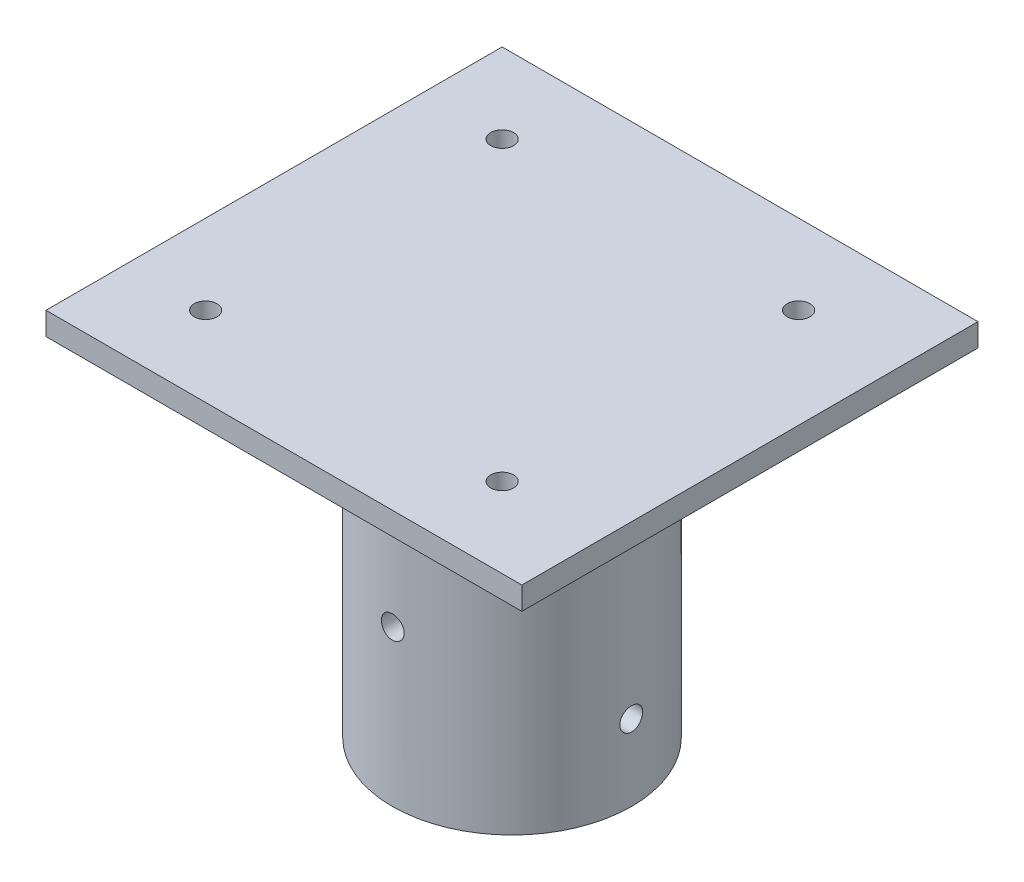
ISO-10303-21;
HEADER;
FILE_DESCRIPTION(('STEP AP214'),'2;1');
FILE_NAME('part.step','',(''),(''),'','','');
FILE_SCHEMA(('AUTOMOTIVE_DESIGN { 1 0 10303 214 1 1 1 1 }'));
ENDSEC;
DATA;
#1=APPLICATION_CONTEXT('core data for automotive mechanical design processes');
#2=APPLICATION_PROTOCOL_DEFINITION('international standard','automotive_design',2000,#1);
#3=PRODUCT_CONTEXT('',#1,'mechanical');
#4=PRODUCT('Part','Part','',(#3));
#5=PRODUCT_RELATED_PRODUCT_CATEGORY('part','',(#4));
#6=PRODUCT_DEFINITION_FORMATION('','',#4);
#7=PRODUCT_DEFINITION_CONTEXT('part definition',#1,'design');
#8=PRODUCT_DEFINITION('design','',#6,#7);
#9=PRODUCT_DEFINITION_SHAPE('','',#8);
#10=(LENGTH_UNIT() NAMED_UNIT(*) SI_UNIT(.MILLI.,.METRE.));
#11=(NAMED_UNIT(*) PLANE_ANGLE_UNIT() SI_UNIT($,.RADIAN.));
#12=(NAMED_UNIT(*) SI_UNIT($,.STERADIAN.) SOLID_ANGLE_UNIT());
#13=UNCERTAINTY_MEASURE_WITH_UNIT(LENGTH_MEASURE(1.E-05),#10,'distance_accuracy_value','');
#14=(GEOMETRIC_REPRESENTATION_CONTEXT(3) GLOBAL_UNCERTAINTY_ASSIGNED_CONTEXT((#13)) GLOBAL_UNIT_ASSIGNED_CONTEXT((#10,
#11,#12)) REPRESENTATION_CONTEXT('',''));
#15=CARTESIAN_POINT('',(0.,0.,0.));
#16=DIRECTION('',(0.,0.,1.));
#17=DIRECTION('',(1.,0.,0.));
#18=AXIS2_PLACEMENT_3D('',#15,#16,#17);
#19=CARTESIAN_POINT('',(15.4110668103448,2.54,-16.51));
#20=DIRECTION('',(0.,-1.,0.));
#21=DIRECTION('',(0.,0.,-1.));
#22=AXIS2_PLACEMENT_3D('',#19,#20,#21);
#23=CYLINDRICAL_SURFACE('',#22,1.27);
#24=CARTESIAN_POINT('',(15.4110668103448,2.54,-16.51));
#25=DIRECTION('',(0.,-1.,0.));
#26=DIRECTION('',(0.,0.,-1.));
#27=AXIS2_PLACEMENT_3D('',#24,#25,#26);
#28=CIRCLE('',#27,1.27);
#29=CARTESIAN_POINT('',(15.4110668103448,2.54,-17.78));
#30=VERTEX_POINT('',#29);
#31=EDGE_CURVE('E125',#30,#30,#28,.T.);
#32=ORIENTED_EDGE('',*,*,#31,.F.);
#33=EDGE_LOOP('',(#32));
#34=FACE_BOUND('',#33,.T.);
#35=CARTESIAN_POINT('',(15.4110668103448,0.,-16.51));
#36=DIRECTION('',(0.,-1.,0.));
#37=DIRECTION('',(0.,0.,-1.));
#38=AXIS2_PLACEMENT_3D('',#35,#36,#37);
#39=CIRCLE('',#38,1.27);
#40=CARTESIAN_POINT('',(15.4110668103448,0.,-17.78));
#41=VERTEX_POINT('',#40);
#42=EDGE_CURVE('E46',#41,#41,#39,.T.);
#43=ORIENTED_EDGE('',*,*,#42,.T.);
#44=EDGE_LOOP('',(#43));
#45=FACE_BOUND('',#44,.T.);
#46=ADVANCED_FACE('F33',(#34,#45),#23,.F.);
#47=CARTESIAN_POINT('',(-17.6089331896552,2.54,-16.51));
#48=DIRECTION('',(0.,-1.,0.));
#49=DIRECTION('',(0.,0.,-1.));
#50=AXIS2_PLACEMENT_3D('',#47,#48,#49);
#51=CYLINDRICAL_SURFACE('',#50,1.27);
#52=CARTESIAN_POINT('',(-17.6089331896552,2.54,-16.51));
#53=DIRECTION('',(0.,-1.,0.));
#54=DIRECTION('',(0.,0.,-1.));
#55=AXIS2_PLACEMENT_3D('',#52,#53,#54);
#56=CIRCLE('',#55,1.27);
#57=CARTESIAN_POINT('',(-17.6089331896552,2.54,-17.78));
#58=VERTEX_POINT('',#57);
#59=EDGE_CURVE('E119',#58,#58,#56,.T.);
#60=ORIENTED_EDGE('',*,*,#59,.F.);
#61=EDGE_LOOP('',(#60));
#62=FACE_BOUND('',#61,.T.);
#63=CARTESIAN_POINT('',(-17.6089331896552,0.,-16.51));
#64=DIRECTION('',(0.,-1.,0.));
#65=DIRECTION('',(0.,0.,-1.));
#66=AXIS2_PLACEMENT_3D('',#63,#64,#65);
#67=CIRCLE('',#66,1.27);
#68=CARTESIAN_POINT('',(-17.6089331896552,0.,-17.78));
#69=VERTEX_POINT('',#68);
#70=EDGE_CURVE('E122',#69,#69,#67,.T.);
#71=ORIENTED_EDGE('',*,*,#70,.T.);
#72=EDGE_LOOP('',(#71));
#73=FACE_BOUND('',#72,.T.);
#74=ADVANCED_FACE('F190',(#62,#73),#51,.F.);
#75=CARTESIAN_POINT('',(26.4989331896552,2.54,25.4));
#76=DIRECTION('',(-1.,0.,0.));
#77=DIRECTION('',(0.,0.,1.));
#78=AXIS2_PLACEMENT_3D('',#75,#76,#77);
#79=PLANE('',#78);
#80=DIRECTION('',(0.,0.,-1.));
#81=VECTOR('',#80,1.);
#82=CARTESIAN_POINT('',(26.4989331896552,0.,25.4));
#83=LINE('',#82,#81);
#84=CARTESIAN_POINT('',(26.4989331896552,0.,25.4));
#85=VERTEX_POINT('',#84);
#86=CARTESIAN_POINT('',(26.4989331896552,0.,-25.4));
#87=VERTEX_POINT('',#86);
#88=EDGE_CURVE('E107',#85,#87,#83,.T.);
#89=ORIENTED_EDGE('',*,*,#88,.T.);
#90=DIRECTION('',(0.,-1.,0.));
#91=VECTOR('',#90,1.);
#92=CARTESIAN_POINT('',(26.4989331896552,2.54,-25.4));
#93=LINE('',#92,#91);
#94=CARTESIAN_POINT('',(26.4989331896552,2.54,-25.4));
#95=VERTEX_POINT('',#94);
#96=EDGE_CURVE('E99',#95,#87,#93,.T.);
#97=ORIENTED_EDGE('',*,*,#96,.F.);
#98=DIRECTION('',(0.,0.,-1.));
#99=VECTOR('',#98,1.);
#100=CARTESIAN_POINT('',(26.4989331896552,2.54,25.4));
#101=LINE('',#100,#99);
#102=CARTESIAN_POINT('',(26.4989331896552,2.54,25.4));
#103=VERTEX_POINT('',#102);
#104=EDGE_CURVE('E90',#103,#95,#101,.T.);
#105=ORIENTED_EDGE('',*,*,#104,.F.);
#106=DIRECTION('',(0.,-1.,0.));
#107=VECTOR('',#106,1.);
#108=CARTESIAN_POINT('',(26.4989331896552,2.54,25.4));
#109=LINE('',#108,#107);
#110=EDGE_CURVE('E55',#103,#85,#109,.T.);
#111=ORIENTED_EDGE('',*,*,#110,.T.);
#112=EDGE_LOOP('',(#89,#97,#105,#111));
#113=FACE_BOUND('',#112,.T.);
#114=ADVANCED_FACE('F188',(#113),#79,.F.);
#115=CARTESIAN_POINT('',(26.4989331896552,2.54,-25.4));
#116=DIRECTION('',(0.,0.,1.));
#117=DIRECTION('',(1.,0.,0.));
#118=AXIS2_PLACEMENT_3D('',#115,#116,#117);
#119=PLANE('',#118);
#120=DIRECTION('',(-1.,0.,0.));
#121=VECTOR('',#120,1.);
#122=CARTESIAN_POINT('',(26.4989331896552,0.,-25.4));
#123=LINE('',#122,#121);
#124=CARTESIAN_POINT('',(-26.4989331896552,0.,-25.4));
#125=VERTEX_POINT('',#124);
#126=EDGE_CURVE('E96',#87,#125,#123,.T.);
#127=ORIENTED_EDGE('',*,*,#126,.T.);
#128=DIRECTION('',(0.,-1.,0.));
#129=VECTOR('',#128,1.);
#130=CARTESIAN_POINT('',(-26.4989331896552,2.54,-25.4));
#131=LINE('',#130,#129);
#132=CARTESIAN_POINT('',(-26.4989331896552,2.54,-25.4));
#133=VERTEX_POINT('',#132);
#134=EDGE_CURVE('E94',#133,#125,#131,.T.);
#135=ORIENTED_EDGE('',*,*,#134,.F.);
#136=DIRECTION('',(-1.,0.,0.));
#137=VECTOR('',#136,1.);
#138=CARTESIAN_POINT('',(26.4989331896552,2.54,-25.4));
#139=LINE('',#138,#137);
#140=EDGE_CURVE('E81',#95,#133,#139,.T.);
#141=ORIENTED_EDGE('',*,*,#140,.F.);
#142=ORIENTED_EDGE('',*,*,#96,.T.);
#143=EDGE_LOOP('',(#127,#135,#141,#142));
#144=FACE_BOUND('',#143,.T.);
#145=ADVANCED_FACE('F95',(#144),#119,.F.);
#146=CARTESIAN_POINT('',(-26.4989331896552,2.54,25.4));
#147=DIRECTION('',(-1.,0.,0.));
#148=DIRECTION('',(0.,0.,1.));
#149=AXIS2_PLACEMENT_3D('',#146,#147,#148);
#150=PLANE('',#149);
#151=DIRECTION('',(0.,0.,-1.));
#152=VECTOR('',#151,1.);
#153=CARTESIAN_POINT('',(-26.4989331896552,0.,25.4));
#154=LINE('',#153,#152);
#155=CARTESIAN_POINT('',(-26.4989331896552,0.,25.4));
#156=VERTEX_POINT('',#155);
#157=EDGE_CURVE('E111',#156,#125,#154,.T.);
#158=ORIENTED_EDGE('',*,*,#157,.F.);
#159=DIRECTION('',(0.,-1.,0.));
#160=VECTOR('',#159,1.);
#161=CARTESIAN_POINT('',(-26.4989331896552,2.54,25.4));
#162=LINE('',#161,#160);
#163=CARTESIAN_POINT('',(-26.4989331896552,2.54,25.4));
#164=VERTEX_POINT('',#163);
#165=EDGE_CURVE('E69',#164,#156,#162,.T.);
#166=ORIENTED_EDGE('',*,*,#165,.F.);
#167=DIRECTION('',(0.,0.,-1.));
#168=VECTOR('',#167,1.);
#169=CARTESIAN_POINT('',(-26.4989331896552,2.54,25.4));
#170=LINE('',#169,#168);
#171=EDGE_CURVE('E89',#164,#133,#170,.T.);
#172=ORIENTED_EDGE('',*,*,#171,.T.);
#173=ORIENTED_EDGE('',*,*,#134,.T.);
#174=EDGE_LOOP('',(#158,#166,#172,#173));
#175=FACE_BOUND('',#174,.T.);
#176=ADVANCED_FACE('F101',(#175),#150,.T.);
#177=CARTESIAN_POINT('',(26.4989331896552,2.54,25.4));
#178=DIRECTION('',(0.,0.,1.));
#179=DIRECTION('',(1.,0.,0.));
#180=AXIS2_PLACEMENT_3D('',#177,#178,#179);
#181=PLANE('',#180);
#182=DIRECTION('',(-1.,0.,0.));
#183=VECTOR('',#182,1.);
#184=CARTESIAN_POINT('',(26.4989331896552,0.,25.4));
#185=LINE('',#184,#183);
#186=EDGE_CURVE('E113',#85,#156,#185,.T.);
#187=ORIENTED_EDGE('',*,*,#186,.F.);
#188=ORIENTED_EDGE('',*,*,#110,.F.);
#189=DIRECTION('',(-1.,0.,0.));
#190=VECTOR('',#189,1.);
#191=CARTESIAN_POINT('',(26.4989331896552,2.54,25.4));
#192=LINE('',#191,#190);
#193=EDGE_CURVE('E102',#103,#164,#192,.T.);
#194=ORIENTED_EDGE('',*,*,#193,.T.);
#195=ORIENTED_EDGE('',*,*,#165,.T.);
#196=EDGE_LOOP('',(#187,#188,#194,#195));
#197=FACE_BOUND('',#196,.T.);
#198=ADVANCED_FACE('F177',(#197),#181,.T.);
#199=CARTESIAN_POINT('',(0.,2.54,0.));
#200=DIRECTION('',(0.,1.,0.));
#201=DIRECTION('',(0.,0.,1.));
#202=AXIS2_PLACEMENT_3D('',#199,#200,#201);
#203=PLANE('',#202);
#204=CARTESIAN_POINT('',(15.4110668103448,2.54,16.51));
#205=DIRECTION('',(0.,-1.,0.));
#206=DIRECTION('',(0.,0.,-1.));
#207=AXIS2_PLACEMENT_3D('',#204,#205,#206);
#208=CIRCLE('',#207,1.27);
#209=CARTESIAN_POINT('',(15.4110668103448,2.54,15.24));
#210=VERTEX_POINT('',#209);
#211=EDGE_CURVE('E310',#210,#210,#208,.T.);
#212=ORIENTED_EDGE('',*,*,#211,.T.);
#213=EDGE_LOOP('',(#212));
#214=FACE_BOUND('',#213,.T.);
#215=CARTESIAN_POINT('',(-17.6089331896552,2.54,16.51));
#216=DIRECTION('',(0.,-1.,0.));
#217=DIRECTION('',(0.,0.,-1.));
#218=AXIS2_PLACEMENT_3D('',#215,#216,#217);
#219=CIRCLE('',#218,1.27);
#220=CARTESIAN_POINT('',(-17.6089331896552,2.54,15.24));
#221=VERTEX_POINT('',#220);
#222=EDGE_CURVE('E109',#221,#221,#219,.T.);
#223=ORIENTED_EDGE('',*,*,#222,.T.);
#224=EDGE_LOOP('',(#223));
#225=FACE_BOUND('',#224,.T.);
#226=ORIENTED_EDGE('',*,*,#104,.T.);
#227=ORIENTED_EDGE('',*,*,#140,.T.);
#228=ORIENTED_EDGE('',*,*,#171,.F.);
#229=ORIENTED_EDGE('',*,*,#193,.F.);
#230=EDGE_LOOP('',(#226,#227,#228,#229));
#231=FACE_BOUND('',#230,.T.);
#232=ORIENTED_EDGE('',*,*,#59,.T.);
#233=EDGE_LOOP('',(#232));
#234=FACE_BOUND('',#233,.T.);
#235=ORIENTED_EDGE('',*,*,#31,.T.);
#236=EDGE_LOOP('',(#235));
#237=FACE_BOUND('',#236,.T.);
#238=ADVANCED_FACE('F85',(#214,#225,#231,#234,#237),#203,.T.);
#239=CARTESIAN_POINT('',(0.,0.,0.));
#240=DIRECTION('',(0.,1.,0.));
#241=DIRECTION('',(0.,0.,1.));
#242=AXIS2_PLACEMENT_3D('',#239,#240,#241);
#243=PLANE('',#242);
#244=CARTESIAN_POINT('',(0.,0.,0.));
#245=DIRECTION('',(0.,1.,0.));
#246=DIRECTION('',(0.,0.,1.));
#247=AXIS2_PLACEMENT_3D('',#244,#245,#246);
#248=CIRCLE('',#247,13.335);
#249=CARTESIAN_POINT('',(0.,0.,13.335));
#250=VERTEX_POINT('',#249);
#251=EDGE_CURVE('E11',#250,#250,#248,.F.);
#252=ORIENTED_EDGE('',*,*,#251,.F.);
#253=EDGE_LOOP('',(#252));
#254=FACE_BOUND('',#253,.T.);
#255=CARTESIAN_POINT('',(15.4110668103448,0.,16.51));
#256=DIRECTION('',(0.,-1.,0.));
#257=DIRECTION('',(0.,0.,-1.));
#258=AXIS2_PLACEMENT_3D('',#255,#256,#257);
#259=CIRCLE('',#258,1.27);
#260=CARTESIAN_POINT('',(15.4110668103448,0.,15.24));
#261=VERTEX_POINT('',#260);
#262=EDGE_CURVE('E300',#261,#261,#259,.T.);
#263=ORIENTED_EDGE('',*,*,#262,.F.);
#264=EDGE_LOOP('',(#263));
#265=FACE_BOUND('',#264,.T.);
#266=CARTESIAN_POINT('',(-17.6089331896552,0.,16.51));
#267=DIRECTION('',(0.,-1.,0.));
#268=DIRECTION('',(0.,0.,-1.));
#269=AXIS2_PLACEMENT_3D('',#266,#267,#268);
#270=CIRCLE('',#269,1.27);
#271=CARTESIAN_POINT('',(-17.6089331896552,0.,15.24));
#272=VERTEX_POINT('',#271);
#273=EDGE_CURVE('E304',#272,#272,#270,.T.);
#274=ORIENTED_EDGE('',*,*,#273,.F.);
#275=EDGE_LOOP('',(#274));
#276=FACE_BOUND('',#275,.T.);
#277=ORIENTED_EDGE('',*,*,#88,.F.);
#278=ORIENTED_EDGE('',*,*,#186,.T.);
#279=ORIENTED_EDGE('',*,*,#157,.T.);
#280=ORIENTED_EDGE('',*,*,#126,.F.);
#281=EDGE_LOOP('',(#277,#278,#279,#280));
#282=FACE_BOUND('',#281,.T.);
#283=ORIENTED_EDGE('',*,*,#70,.F.);
#284=EDGE_LOOP('',(#283));
#285=FACE_BOUND('',#284,.T.);
#286=ORIENTED_EDGE('',*,*,#42,.F.);
#287=EDGE_LOOP('',(#286));
#288=FACE_BOUND('',#287,.T.);
#289=ADVANCED_FACE('F173',(#254,#265,#276,#282,#285,#288),#243,.F.);
#290=CARTESIAN_POINT('',(-17.6089331896552,2.54,16.51));
#291=DIRECTION('',(0.,-1.,0.));
#292=DIRECTION('',(0.,0.,-1.));
#293=AXIS2_PLACEMENT_3D('',#290,#291,#292);
#294=CYLINDRICAL_SURFACE('',#293,1.27);
#295=ORIENTED_EDGE('',*,*,#222,.F.);
#296=EDGE_LOOP('',(#295));
#297=FACE_BOUND('',#296,.T.);
#298=ORIENTED_EDGE('',*,*,#273,.T.);
#299=EDGE_LOOP('',(#298));
#300=FACE_BOUND('',#299,.T.);
#301=ADVANCED_FACE('F169',(#297,#300),#294,.F.);
#302=CARTESIAN_POINT('',(15.4110668103448,2.54,16.51));
#303=DIRECTION('',(0.,-1.,0.));
#304=DIRECTION('',(0.,0.,-1.));
#305=AXIS2_PLACEMENT_3D('',#302,#303,#304);
#306=CYLINDRICAL_SURFACE('',#305,1.27);
#307=ORIENTED_EDGE('',*,*,#211,.F.);
#308=EDGE_LOOP('',(#307));
#309=FACE_BOUND('',#308,.T.);
#310=ORIENTED_EDGE('',*,*,#262,.T.);
#311=EDGE_LOOP('',(#310));
#312=FACE_BOUND('',#311,.T.);
#313=ADVANCED_FACE('F165',(#309,#312),#306,.F.);
#314=CARTESIAN_POINT('',(0.,-38.1,0.));
#315=DIRECTION('',(0.,-1.,0.));
#316=DIRECTION('',(0.,0.,-1.));
#317=AXIS2_PLACEMENT_3D('',#314,#315,#316);
#318=PLANE('',#317);
#319=CARTESIAN_POINT('',(0.,-38.1,0.));
#320=DIRECTION('',(0.,-1.,0.));
#321=DIRECTION('',(0.,0.,-1.));
#322=AXIS2_PLACEMENT_3D('',#319,#320,#321);
#323=CIRCLE('',#322,13.335);
#324=CARTESIAN_POINT('',(0.,-38.1,-13.335));
#325=VERTEX_POINT('',#324);
#326=EDGE_CURVE('E294',#325,#325,#323,.T.);
#327=ORIENTED_EDGE('',*,*,#326,.T.);
#328=EDGE_LOOP('',(#327));
#329=FACE_BOUND('',#328,.T.);
#330=CARTESIAN_POINT('',(0.,-38.1,0.));
#331=DIRECTION('',(0.,-1.,0.));
#332=DIRECTION('',(0.,0.,-1.));
#333=AXIS2_PLACEMENT_3D('',#330,#331,#332);
#334=CIRCLE('',#333,9.525);
#335=CARTESIAN_POINT('',(0.,-38.1,-9.525));
#336=VERTEX_POINT('',#335);
#337=EDGE_CURVE('E157',#336,#336,#334,.T.);
#338=ORIENTED_EDGE('',*,*,#337,.F.);
#339=EDGE_LOOP('',(#338));
#340=FACE_BOUND('',#339,.T.);
#341=ADVANCED_FACE('F163',(#329,#340),#318,.T.);
#342=CARTESIAN_POINT('',(0.,-38.1,0.));
#343=DIRECTION('',(0.,1.,0.));
#344=DIRECTION('',(0.,0.,1.));
#345=AXIS2_PLACEMENT_3D('',#342,#343,#344);
#346=CYLINDRICAL_SURFACE('',#345,13.335);
#347=CARTESIAN_POINT('',(13.274386049833,-29.639158728267,-1.27));
#348=CARTESIAN_POINT('',(13.2743868469173,-29.7103214111816,-1.26999690913642));
#349=CARTESIAN_POINT('',(13.2749644592863,-29.7815315712348,-1.26399860947089));
#350=CARTESIAN_POINT('',(13.2772122693226,-29.9219787923522,-1.24016013345922));
#351=CARTESIAN_POINT('',(13.2788836813539,-29.9912135710349,-1.22230679502754));
#352=CARTESIAN_POINT('',(13.2831280871879,-30.1256557279515,-1.17528174591728));
#353=CARTESIAN_POINT('',(13.2857005451113,-30.1908654729413,-1.14611676151429));
#354=CARTESIAN_POINT('',(13.2914565288024,-30.3154495928365,-1.07730894479932));
#355=CARTESIAN_POINT('',(13.2946399303542,-30.3748251502348,-1.037668241776));
#356=CARTESIAN_POINT('',(13.3012709264253,-30.4862665671829,-0.948893028631839));
#357=CARTESIAN_POINT('',(13.3047192706881,-30.5383104063979,-0.899730929279626));
#358=CARTESIAN_POINT('',(13.3114847883348,-30.6334215604194,-0.793367264054129));
#359=CARTESIAN_POINT('',(13.314801955795,-30.6764884702188,-0.736165335647247));
#360=CARTESIAN_POINT('',(13.3209386914304,-30.7524986150216,-0.61521180105229));
#361=CARTESIAN_POINT('',(13.3237573029985,-30.785422475832,-0.551447966984732));
#362=CARTESIAN_POINT('',(13.3285712081045,-30.8400879984416,-0.419265655813881));
#363=CARTESIAN_POINT('',(13.3305665199866,-30.8618299093911,-0.350847282459078));
#364=CARTESIAN_POINT('',(13.3335037516924,-30.8934500902913,-0.211519686373393));
#365=CARTESIAN_POINT('',(13.3344488698878,-30.9033643881426,-0.140618708612214));
#366=CARTESIAN_POINT('',(13.3351900917629,-30.9111593582529,0.00184675439462198));
#367=CARTESIAN_POINT('',(13.3349862226751,-30.9090403157162,0.0734112238746079));
#368=CARTESIAN_POINT('',(13.3334550645238,-30.8928580687467,0.214927729802791));
#369=CARTESIAN_POINT('',(13.3321314193528,-30.8788336055407,0.284884241190018));
#370=CARTESIAN_POINT('',(13.3285136903504,-30.8392989392459,0.42144594727629));
#371=CARTESIAN_POINT('',(13.3262195949243,-30.8137885989263,0.48805110192347));
#372=CARTESIAN_POINT('',(13.3209126684575,-30.7519636325966,0.61614189000316));
#373=CARTESIAN_POINT('',(13.317898694314,-30.7156318001285,0.677619169198242));
#374=CARTESIAN_POINT('',(13.3114903601078,-30.6332076701174,0.79361792615696));
#375=CARTESIAN_POINT('',(13.3080959899353,-30.5871151131311,0.848139218966395));
#376=CARTESIAN_POINT('',(13.3012920464841,-30.4862599091107,0.948905136138835));
#377=CARTESIAN_POINT('',(13.2978824663419,-30.4314635721972,0.995116046932721));
#378=CARTESIAN_POINT('',(13.2914458610945,-30.3148732641482,1.07768859907192));
#379=CARTESIAN_POINT('',(13.2884188364632,-30.253079284344,1.11405022821574));
#380=CARTESIAN_POINT('',(13.2830897149895,-30.124222566163,1.17589154001857));
#381=CARTESIAN_POINT('',(13.280787750158,-30.0571588711087,1.20136924135292));
#382=CARTESIAN_POINT('',(13.2771720818416,-29.9196787569593,1.24069332336114));
#383=CARTESIAN_POINT('',(13.2758583511017,-29.8492624303854,1.2545400248142));
#384=CARTESIAN_POINT('',(13.2743725334651,-29.70737159093,1.2701658922585));
#385=CARTESIAN_POINT('',(13.2741959889325,-29.6359023118559,1.27199217747918));
#386=CARTESIAN_POINT('',(13.2749927694431,-29.4936747044953,1.26364901982312));
#387=CARTESIAN_POINT('',(13.2759660804178,-29.4229163675213,1.25347972371141));
#388=CARTESIAN_POINT('',(13.2789488467622,-29.2842559279822,1.22147345209721));
#389=CARTESIAN_POINT('',(13.2809563311721,-29.2163486570659,1.19965866806805));
#390=CARTESIAN_POINT('',(13.2857796429061,-29.0851575023909,1.14500328835842));
#391=CARTESIAN_POINT('',(13.2885954870721,-29.0218737149957,1.11216246295102));
#392=CARTESIAN_POINT('',(13.2947290408874,-28.9015108918456,1.036268830149));
#393=CARTESIAN_POINT('',(13.2980482761484,-28.844451656614,0.993184745485367));
#394=CARTESIAN_POINT('',(13.3048095765997,-28.7383582269,0.898072526765467));
#395=CARTESIAN_POINT('',(13.3082516445464,-28.6893242126476,0.846044191893379));
#396=CARTESIAN_POINT('',(13.3148841783722,-28.6005111332979,0.734316193716956));
#397=CARTESIAN_POINT('',(13.3180737871992,-28.5607627691324,0.674592068168392));
#398=CARTESIAN_POINT('',(13.3238295826794,-28.4918603759301,0.549288984830174));
#399=CARTESIAN_POINT('',(13.3263957771804,-28.4627062135287,0.483710100755817));
#400=CARTESIAN_POINT('',(13.3306117116936,-28.4158720381642,0.348667075029857));
#401=CARTESIAN_POINT('',(13.3322629428356,-28.3981733480827,0.279209459215136));
#402=CARTESIAN_POINT('',(13.3344690015582,-28.3746915358012,0.138291925472422));
#403=CARTESIAN_POINT('',(13.3350238568874,-28.3689081120332,0.0668320582665481));
#404=CARTESIAN_POINT('',(13.3349746503252,-28.3694250183522,-0.075759620108641));
#405=CARTESIAN_POINT('',(13.3343751647331,-28.375677632427,-0.146891610662353));
#406=CARTESIAN_POINT('',(13.332093667224,-28.3999892361263,-0.287089995492484));
#407=CARTESIAN_POINT('',(13.3304116542493,-28.4180482372866,-0.356156387750545));
#408=CARTESIAN_POINT('',(13.3261536354617,-28.4654470869256,-0.490263693862336));
#409=CARTESIAN_POINT('',(13.323577727747,-28.4947856975889,-0.555305048511521));
#410=CARTESIAN_POINT('',(13.3178193734197,-28.5639057769941,-0.679547371920361));
#411=CARTESIAN_POINT('',(13.3146369321804,-28.6036871532252,-0.738748392412255));
#412=CARTESIAN_POINT('',(13.3080071668593,-28.6927426145621,-0.849874049638027));
#413=CARTESIAN_POINT('',(13.3045588824539,-28.7420521869527,-0.901770190133521));
#414=CARTESIAN_POINT('',(13.2977942287813,-28.848695700278,-0.996573548158071));
#415=CARTESIAN_POINT('',(13.2944778914544,-28.9060315691298,-1.03947859982581));
#416=CARTESIAN_POINT('',(13.2883443003179,-29.0272447407571,-1.1151592701531));
#417=CARTESIAN_POINT('',(13.285528230508,-29.0911370119773,-1.1479109914547));
#418=CARTESIAN_POINT('',(13.2807282120963,-29.2234992902852,-1.20217808173745));
#419=CARTESIAN_POINT('',(13.2787433199025,-29.291964003536,-1.22370619912514));
#420=CARTESIAN_POINT('',(13.2763339820712,-29.4072109768856,-1.24951157692285));
#421=CARTESIAN_POINT('',(13.2756069324223,-29.4532550406283,-1.25718432320962));
#422=CARTESIAN_POINT('',(13.2746327060267,-29.5459121844021,-1.26742953800791));
#423=CARTESIAN_POINT('',(13.2743855274973,-29.5925252623187,-1.27000202546722));
#424=CARTESIAN_POINT('',(13.274386049833,-29.639158728267,-1.27));
#425=B_SPLINE_CURVE_WITH_KNOTS('',3,(#347,#348,#349,#350,#351,#352,#353,#354,#355,#356,#357,
#358,#359,#360,#361,#362,#363,#364,#365,#366,#367,#368,#369,#370,#371,#372,#373,#374,#375,#376,
#377,#378,#379,#380,#381,#382,#383,#384,#385,#386,#387,#388,#389,#390,#391,#392,#393,#394,#395,
#396,#397,#398,#399,#400,#401,#402,#403,#404,#405,#406,#407,#408,#409,#410,#411,#412,#413,#414,
#415,#416,#417,#418,#419,#420,#421,#422,#423,#424),.UNSPECIFIED.,.T.,.F.,(4,2,2,2,2,2,2,2,2,2,2,
2,2,2,2,2,2,2,2,2,2,2,2,2,2,2,2,2,2,2,2,2,2,2,2,2,2,2,4),(0.,0.213317760744161,
0.426872754929095,0.640300956522477,0.853685810142188,1.06769847784603,1.28172079895024,
1.49614942416917,1.71057327139391,1.92434228416476,2.13810623037985,2.35117722571515,
2.56425076684471,2.77766492573396,2.99108475795557,3.20535176621732,3.41961903991603,
3.6339253025091,3.84822565441125,4.06168546036531,4.27514265468187,4.48819453248632,
4.70125084948957,4.9149662728336,5.12868649513148,5.34310363918945,5.55751808397385,
5.77158205875285,5.98564061564098,6.19885230011899,6.41206419292569,6.62525269470629,
6.83843930794607,7.05243578522187,7.2664837529529,7.48103175484791,7.6953355270654,
7.83512485317192,7.97491365995091),.UNSPECIFIED.);
#426=CARTESIAN_POINT('',(13.274386049833,-29.639158728267,-1.27));
#427=VERTEX_POINT('',#426);
#428=EDGE_CURVE('E135',#427,#427,#425,.T.);
#429=ORIENTED_EDGE('',*,*,#428,.T.);
#430=EDGE_LOOP('',(#429));
#431=FACE_BOUND('',#430,.T.);
#432=CARTESIAN_POINT('',(0.,-22.0537655598851,13.335));
#433=CARTESIAN_POINT('',(-0.0711635081528358,-22.0537624697612,13.334999216253));
#434=CARTESIAN_POINT('',(-0.142374490824704,-22.0477640356777,13.3344242845552));
#435=CARTESIAN_POINT('',(-0.282823421127832,-22.0239249772094,13.3321860506007));
#436=CARTESIAN_POINT('',(-0.352059087023926,-22.0060711935874,13.330521538958));
#437=CARTESIAN_POINT('',(-0.486503119916307,-21.95904484214,13.3262921008166));
#438=CARTESIAN_POINT('',(-0.551713846155949,-21.9298789794153,13.3237277077977));
#439=CARTESIAN_POINT('',(-0.676299609995825,-21.8610690943505,13.3179855056828));
#440=CARTESIAN_POINT('',(-0.735675831313909,-21.8214272034576,13.3148078214022));
#441=CARTESIAN_POINT('',(-0.847116497756168,-21.732650790725,13.3081835300779));
#442=CARTESIAN_POINT('',(-0.899159133030901,-21.6834889450059,13.3047361664042));
#443=CARTESIAN_POINT('',(-0.994267963663081,-21.5771262924404,13.2979673397345));
#444=CARTESIAN_POINT('',(-1.03733375032088,-21.5199251197764,13.2946458824765));
#445=CARTESIAN_POINT('',(-1.11334272128709,-21.3989722465349,13.288497098389));
#446=CARTESIAN_POINT('',(-1.14626632494994,-21.335208188123,13.2856707318687));
#447=CARTESIAN_POINT('',(-1.20093131024815,-21.2030253893205,13.2808413325226));
#448=CARTESIAN_POINT('',(-1.22267294408556,-21.1346067539503,13.2788382811276));
#449=CARTESIAN_POINT('',(-1.25429254499341,-20.9952783590119,13.2758890183942));
#450=CARTESIAN_POINT('',(-1.26420651604996,-20.9243768393049,13.2749396003631));
#451=CARTESIAN_POINT('',(-1.27200064480512,-20.7819103154263,13.2741950982845));
#452=CARTESIAN_POINT('',(-1.26988109123715,-20.7103453272151,13.2743999865404));
#453=CARTESIAN_POINT('',(-1.25369803603016,-20.5688310772751,13.275938022614));
#454=CARTESIAN_POINT('',(-1.23967379001531,-20.4988772804572,13.2772674621825));
#455=CARTESIAN_POINT('',(-1.20014049937255,-20.3623208914028,13.2808990076771));
#456=CARTESIAN_POINT('',(-1.17463131261078,-20.2957183406515,13.2832011256407));
#457=CARTESIAN_POINT('',(-1.11280873306153,-20.167630705764,13.2885229061995));
#458=CARTESIAN_POINT('',(-1.07647786438079,-20.1061541066268,13.2915437278262));
#459=CARTESIAN_POINT('',(-0.994055790451399,-19.9901563008699,13.2979615400113));
#460=CARTESIAN_POINT('',(-0.947964326260541,-19.9356352788388,13.3013585405482));
#461=CARTESIAN_POINT('',(-0.847109896289634,-19.8348681241255,13.308162472193));
#462=CARTESIAN_POINT('',(-0.792313017791322,-19.7886559257528,13.3115693887454));
#463=CARTESIAN_POINT('',(-0.675721167789979,-19.7060810339607,13.317996428824));
#464=CARTESIAN_POINT('',(-0.613926189504414,-19.6697183500876,13.3210165519753));
#465=CARTESIAN_POINT('',(-0.485069203164171,-19.6078762799618,13.3263305791277));
#466=CARTESIAN_POINT('',(-0.418006395904143,-19.5823985489028,13.3286243726677));
#467=CARTESIAN_POINT('',(-0.280528211142448,-19.5430741352897,13.332226127712));
#468=CARTESIAN_POINT('',(-0.210112924609289,-19.529227137329,13.3335341159497));
#469=CARTESIAN_POINT('',(-0.0682225652598041,-19.5136001518734,13.3350134530462));
#470=CARTESIAN_POINT('',(0.00324730474050592,-19.5117733238111,13.3351892139471));
#471=CARTESIAN_POINT('',(0.145476224446675,-19.5201156067162,13.3343961092611));
#472=CARTESIAN_POINT('',(0.21623528283789,-19.5302845709276,13.3334272576773));
#473=CARTESIAN_POINT('',(0.354899292101595,-19.5622909302073,13.3304566548909));
#474=CARTESIAN_POINT('',(0.422809334770266,-19.584106460471,13.3284568394202));
#475=CARTESIAN_POINT('',(0.554005702706708,-19.6387642611668,13.3236487506418));
#476=CARTESIAN_POINT('',(0.617291933457325,-19.6716067569287,13.3208404608134));
#477=CARTESIAN_POINT('',(0.737656416218446,-19.747502845362,13.3147187605691));
#478=CARTESIAN_POINT('',(0.794715135615169,-19.7905872908727,13.3114038349521));
#479=CARTESIAN_POINT('',(0.900807356419314,-19.8856999316131,13.3046458997882));
#480=CARTESIAN_POINT('',(0.949840675340192,-19.9377283301609,13.301202887331));
#481=CARTESIAN_POINT('',(1.03865225952051,-20.0494560237003,13.2945636161446));
#482=CARTESIAN_POINT('',(1.07839983615792,-20.1091797698455,13.2913681983121));
#483=CARTESIAN_POINT('',(1.14730084745466,-20.2344818850832,13.28559845465));
#484=CARTESIAN_POINT('',(1.17645441526317,-20.3000601805807,13.2830241210144));
#485=CARTESIAN_POINT('',(1.22328819580203,-20.4351035838173,13.2787931246));
#486=CARTESIAN_POINT('',(1.24098682803767,-20.50456225553,13.2771349892082));
#487=CARTESIAN_POINT('',(1.26446816681224,-20.6454820155888,13.2749194563157));
#488=CARTESIAN_POINT('',(1.27025118055733,-20.7169430522622,13.2743620304367));
#489=CARTESIAN_POINT('',(1.2697330812034,-20.8595340210239,13.2744115749952));
#490=CARTESIAN_POINT('',(1.26348017839898,-20.9306641348267,13.275013900012));
#491=CARTESIAN_POINT('',(1.23916865758783,-21.0708586942356,13.2773051853598));
#492=CARTESIAN_POINT('',(1.22111002472549,-21.1399231372422,13.2789941470582));
#493=CARTESIAN_POINT('',(1.1737126437666,-21.2740265471237,13.2832671344549));
#494=CARTESIAN_POINT('',(1.14437514970156,-21.3390659605854,13.2858510606442));
#495=CARTESIAN_POINT('',(1.07525790421785,-21.4633048677893,13.2916230314128));
#496=CARTESIAN_POINT('',(1.0354782431614,-21.5225044120614,13.2948110707643));
#497=CARTESIAN_POINT('',(0.946424665137247,-21.6336301629076,13.3014473286504));
#498=CARTESIAN_POINT('',(0.897114868823056,-21.6855275602217,13.304896499468));
#499=CARTESIAN_POINT('',(0.790470390957934,-21.7803333493683,13.3116576724778));
#500=CARTESIAN_POINT('',(0.733133784302311,-21.8232395786281,13.3149696415164));
#501=CARTESIAN_POINT('',(0.611920014664232,-21.8989215126755,13.3210910710836));
#502=CARTESIAN_POINT('',(0.548028015888275,-21.9316735325806,13.3238993504162));
#503=CARTESIAN_POINT('',(0.415666316109973,-21.9859412566564,13.3286838879248));
#504=CARTESIAN_POINT('',(0.347201907183489,-22.0074697051212,13.3306610892879));
#505=CARTESIAN_POINT('',(0.231954047618942,-22.0332760182206,13.3330606001838));
#506=CARTESIAN_POINT('',(0.185908727204518,-22.0409491854458,13.3337845083227));
#507=CARTESIAN_POINT('',(0.093249065651432,-22.0511949594607,13.334754464159));
#508=CARTESIAN_POINT('',(0.046634726593805,-22.0537675848988,13.3350005136035));
#509=CARTESIAN_POINT('',(0.,-22.0537655598851,13.335));
#510=B_SPLINE_CURVE_WITH_KNOTS('',3,(#432,#433,#434,#435,#436,#437,#438,#439,#440,#441,#442,
#443,#444,#445,#446,#447,#448,#449,#450,#451,#452,#453,#454,#455,#456,#457,#458,#459,#460,#461,
#462,#463,#464,#465,#466,#467,#468,#469,#470,#471,#472,#473,#474,#475,#476,#477,#478,#479,#480,
#481,#482,#483,#484,#485,#486,#487,#488,#489,#490,#491,#492,#493,#494,#495,#496,#497,#498,#499,
#500,#501,#502,#503,#504,#505,#506,#507,#508,#509),.UNSPECIFIED.,.T.,.F.,(4,2,2,2,2,2,2,2,2,2,2,
2,2,2,2,2,2,2,2,2,2,2,2,2,2,2,2,2,2,2,2,2,2,2,2,2,2,2,4),(0.,0.213320239518513,
0.426877657583685,0.640308685002847,0.853696321248729,1.06770574528646,1.28172491065831,
1.49615471180723,1.7105796764194,1.9243502417754,2.13811567792383,2.35117895035028,
2.5642448596505,2.77765673115046,2.99107426503707,3.20534454823054,3.41961503909581,
3.63391810089401,3.84821535095419,4.06167702380868,4.27513608521005,4.48819580897042,
4.70125988675043,4.91497411881345,5.12869320976857,5.34310893658164,5.55752196844988,
5.77158936248332,5.98565123740384,6.19885746381572,6.41206395851396,6.62524675486442,
6.83842770647942,7.05242745805815,7.26647862233305,7.48102537254377,7.6953279727419,
7.8351210728434,7.97491366184148),.UNSPECIFIED.);
#511=CARTESIAN_POINT('',(0.,-22.0537655598851,13.335));
#512=VERTEX_POINT('',#511);
#513=EDGE_CURVE('E134',#512,#512,#510,.T.);
#514=ORIENTED_EDGE('',*,*,#513,.T.);
#515=EDGE_LOOP('',(#514));
#516=FACE_BOUND('',#515,.T.);
#517=ORIENTED_EDGE('',*,*,#326,.F.);
#518=EDGE_LOOP('',(#517));
#519=FACE_BOUND('',#518,.T.);
#520=ORIENTED_EDGE('',*,*,#251,.T.);
#521=EDGE_LOOP('',(#520));
#522=FACE_BOUND('',#521,.T.);
#523=ADVANCED_FACE('F159',(#431,#516,#519,#522),#346,.T.);
#524=CARTESIAN_POINT('',(0.,-38.1,0.));
#525=DIRECTION('',(0.,1.,0.));
#526=DIRECTION('',(0.,0.,1.));
#527=AXIS2_PLACEMENT_3D('',#524,#525,#526);
#528=CYLINDRICAL_SURFACE('',#527,9.525);
#529=CARTESIAN_POINT('',(9.43995365454725,-29.639158728267,-1.27));
#530=CARTESIAN_POINT('',(9.43995473278621,-29.7101541764842,-1.26999700657725));
#531=CARTESIAN_POINT('',(9.44076321612223,-29.7811930092809,-1.26402672457402));
#532=CARTESIAN_POINT('',(9.4439082692674,-29.9212907918363,-1.24030610629262));
#533=CARTESIAN_POINT('',(9.44624640249994,-29.9903476403866,-1.22254371727215));
#534=CARTESIAN_POINT('',(9.45218132494211,-30.1244329470956,-1.17577432573965));
#535=CARTESIAN_POINT('',(9.4557772247707,-30.1894642136455,-1.14677526724626));
#536=CARTESIAN_POINT('',(9.46382144734759,-30.3137262613412,-1.07837328699263));
#537=CARTESIAN_POINT('',(9.46826963327761,-30.3729579711923,-1.0389720347231));
#538=CARTESIAN_POINT('',(9.47754884597359,-30.4843268719818,-0.950616402608363));
#539=CARTESIAN_POINT('',(9.4823819019317,-30.5364218979735,-0.901609082445338));
#540=CARTESIAN_POINT('',(9.4918680892433,-30.6316740441317,-0.795546560241096));
#541=CARTESIAN_POINT('',(9.49652121134804,-30.6748307053543,-0.738490945209716));
#542=CARTESIAN_POINT('',(9.50514418347738,-30.7511337977569,-0.61768464532903));
#543=CARTESIAN_POINT('',(9.50911138878921,-30.7842418389663,-0.553909507946626));
#544=CARTESIAN_POINT('',(9.51589316919065,-30.8392618425218,-0.421642423183731));
#545=CARTESIAN_POINT('',(9.51870779271275,-30.8611742753268,-0.353150674140727));
#546=CARTESIAN_POINT('',(9.52285297734205,-30.8930544358504,-0.213826963133948));
#547=CARTESIAN_POINT('',(9.52419226860221,-30.9030924557996,-0.143011349403387));
#548=CARTESIAN_POINT('',(9.52526573461915,-30.9111568248148,-0.000688976462823485));
#549=CARTESIAN_POINT('',(9.52499998071398,-30.9091837077297,0.0708177518887644));
#550=CARTESIAN_POINT('',(9.52290033514236,-30.8933378743735,0.212013879035762));
#551=CARTESIAN_POINT('',(9.52107640699508,-30.8795407631535,0.281711931724732));
#552=CARTESIAN_POINT('',(9.51607649798604,-30.8405569306083,0.417794517922471));
#553=CARTESIAN_POINT('',(9.51290048847411,-30.8153699679352,0.484178981184067));
#554=CARTESIAN_POINT('',(9.50553610067644,-30.7542419431546,0.611982398349321));
#555=CARTESIAN_POINT('',(9.50134467612633,-30.7182684425457,0.673385654339319));
#556=CARTESIAN_POINT('',(9.49241783516091,-30.6366121198924,0.789312423616588));
#557=CARTESIAN_POINT('',(9.48768239038523,-30.5909287915583,0.843835577925427));
#558=CARTESIAN_POINT('',(9.47815343440745,-30.490726844559,0.944899089081321));
#559=CARTESIAN_POINT('',(9.47335975799494,-30.436142295464,0.991374086291684));
#560=CARTESIAN_POINT('',(9.46429081718466,-30.3199130618454,1.07451330091316));
#561=CARTESIAN_POINT('',(9.46001555484262,-30.2582683493271,1.11117747942084));
#562=CARTESIAN_POINT('',(9.45246760972306,-30.1296073280468,1.17365961664928));
#563=CARTESIAN_POINT('',(9.44919545396389,-30.0625882188977,1.19947187655759));
#564=CARTESIAN_POINT('',(9.44403416920732,-29.9251131851616,1.23945707178527));
#565=CARTESIAN_POINT('',(9.44214496400963,-29.8546574501601,1.25363064839881));
#566=CARTESIAN_POINT('',(9.4399775958157,-29.7128877305388,1.26984862088142));
#567=CARTESIAN_POINT('',(9.43968718809884,-29.6415844725058,1.27198520747746));
#568=CARTESIAN_POINT('',(9.44071787428403,-29.4996370006405,1.26431222999885));
#569=CARTESIAN_POINT('',(9.44203892897016,-29.4289927708124,1.25450295663408));
#570=CARTESIAN_POINT('',(9.44613249477349,-29.2906478768994,1.22329451198508));
#571=CARTESIAN_POINT('',(9.44889936345158,-29.2229368702005,1.20194038455334));
#572=CARTESIAN_POINT('',(9.45556820474149,-29.0920561182247,1.1482949162588));
#573=CARTESIAN_POINT('',(9.45947022239105,-29.0288865532564,1.11600314142958));
#574=CARTESIAN_POINT('',(9.46799888603394,-28.9084659361371,1.04117398074929));
#575=CARTESIAN_POINT('',(9.472629732561,-28.8512526025531,0.99857638210601));
#576=CARTESIAN_POINT('',(9.48208126132984,-28.7447542823594,0.904429435186275));
#577=CARTESIAN_POINT('',(9.48690195198958,-28.695469647813,0.852879689612839));
#578=CARTESIAN_POINT('',(9.49622782396136,-28.6059016165271,0.741887993207481));
#579=CARTESIAN_POINT('',(9.5007307448157,-28.565678962371,0.682396806992154));
#580=CARTESIAN_POINT('',(9.50887951838722,-28.4957978690856,0.557449007221691));
#581=CARTESIAN_POINT('',(9.51252539038292,-28.4661391923218,0.491992527896201));
#582=CARTESIAN_POINT('',(9.51853928578883,-28.4183272471585,0.357170210552382));
#583=CARTESIAN_POINT('',(9.52091113861198,-28.4001394707989,0.287816787997077));
#584=CARTESIAN_POINT('',(9.52412571096002,-28.3756735199992,0.147006623323734));
#585=CARTESIAN_POINT('',(9.5249685094364,-28.3693947306476,0.0755499899968906));
#586=CARTESIAN_POINT('',(9.52502951002746,-28.3689375785694,-0.0668463698068565));
#587=CARTESIAN_POINT('',(9.52426025620026,-28.3746657844395,-0.137785808960392));
#588=CARTESIAN_POINT('',(9.52120862594611,-28.3978613894493,-0.277683876338242));
#589=CARTESIAN_POINT('',(9.51892625163831,-28.415328772148,-0.346642507336563));
#590=CARTESIAN_POINT('',(9.51310363467968,-28.4614763281607,-0.480604978963924));
#591=CARTESIAN_POINT('',(9.5095639653928,-28.4901513910361,-0.545610606480382));
#592=CARTESIAN_POINT('',(9.5016177086645,-28.557890602292,-0.669902189930604));
#593=CARTESIAN_POINT('',(9.49721110521588,-28.5969549425063,-0.729188040223469));
#594=CARTESIAN_POINT('',(9.48798134918257,-28.6847071713393,-0.840833526652378));
#595=CARTESIAN_POINT('',(9.48315534340443,-28.7334644450054,-0.893138394799139));
#596=CARTESIAN_POINT('',(9.47365304209447,-28.8390733771121,-0.988859436978822));
#597=CARTESIAN_POINT('',(9.46897678216391,-28.895926943157,-1.03227351031697));
#598=CARTESIAN_POINT('',(9.46028149777013,-29.0164040311645,-1.10914682271345));
#599=CARTESIAN_POINT('',(9.45626545218103,-29.0800562088758,-1.14256147172496));
#600=CARTESIAN_POINT('',(9.44938017780675,-29.2120885051403,-1.19817844108745));
#601=CARTESIAN_POINT('',(9.44650972024153,-29.2804634650644,-1.22039278188138));
#602=CARTESIAN_POINT('',(9.44292709978839,-29.3975083852576,-1.24774630040403));
#603=CARTESIAN_POINT('',(9.4418177217511,-29.4454445316013,-1.25607920066244));
#604=CARTESIAN_POINT('',(9.44033063336284,-29.5419665867812,-1.2672070499291));
#605=CARTESIAN_POINT('',(9.43995291634302,-29.5905524896908,-1.27000204941337));
#606=CARTESIAN_POINT('',(9.43995365454725,-29.639158728267,-1.27));
#607=B_SPLINE_CURVE_WITH_KNOTS('',3,(#529,#530,#531,#532,#533,#534,#535,#536,#537,#538,#539,
#540,#541,#542,#543,#544,#545,#546,#547,#548,#549,#550,#551,#552,#553,#554,#555,#556,#557,#558,
#559,#560,#561,#562,#563,#564,#565,#566,#567,#568,#569,#570,#571,#572,#573,#574,#575,#576,#577,
#578,#579,#580,#581,#582,#583,#584,#585,#586,#587,#588,#589,#590,#591,#592,#593,#594,#595,#596,
#597,#598,#599,#600,#601,#602,#603,#604,#605,#606),.UNSPECIFIED.,.T.,.F.,(4,2,2,2,2,2,2,2,2,2,2,
2,2,2,2,2,2,2,2,2,2,2,2,2,2,2,2,2,2,2,2,2,2,2,2,2,2,2,4),(0.,0.212808749666827,
0.425835347263112,0.638711614843842,0.851553737787976,1.0656036290054,1.27966450797622,
1.49453318392068,1.70939282996749,1.92297411646955,2.13654591017784,2.3487621850402,
2.56098295691941,2.7738484556832,2.98672505639839,3.2012567106739,3.41578921563223,
3.63043424059996,3.8450674377828,4.05805451138126,4.2710364019115,4.48319324858408,
4.69535851386163,4.90879465368982,5.12224026825245,5.33707664969061,5.55190819812322,
5.76609034592763,5.98026143429664,6.19277215757351,6.40528258322708,6.61769622195974,
6.83011378309586,7.0441105140288,7.2581577493857,7.47314572157234,7.68790246967507,
7.83360092498202,7.97929805229276),.UNSPECIFIED.);
#608=CARTESIAN_POINT('',(9.43995365454725,-29.639158728267,-1.27));
#609=VERTEX_POINT('',#608);
#610=EDGE_CURVE('E36',#609,#609,#607,.T.);
#611=ORIENTED_EDGE('',*,*,#610,.F.);
#612=EDGE_LOOP('',(#611));
#613=FACE_BOUND('',#612,.T.);
#614=CARTESIAN_POINT('',(0.,-22.0537655598851,9.525));
#615=CARTESIAN_POINT('',(-0.0709986106499955,-22.0537625692212,9.52499895696515));
#616=CARTESIAN_POINT('',(-0.142040596840437,-22.0477917732789,9.52419780911768));
#617=CARTESIAN_POINT('',(-0.28214493046268,-22.0240689282386,9.52107894565584));
#618=CARTESIAN_POINT('',(-0.351205179181478,-22.0063048376254,9.51875968000495));
#619=CARTESIAN_POINT('',(-0.485297678518135,-21.9595304692462,9.51286565704157));
#620=CARTESIAN_POINT('',(-0.550332708742143,-21.9305280548757,9.50929177773968));
#621=CARTESIAN_POINT('',(-0.674601073344239,-21.8621181696181,9.50128520529349));
#622=CARTESIAN_POINT('',(-0.733835341024011,-21.8227123763444,9.49685265064689));
#623=CARTESIAN_POINT('',(-0.845201397290471,-21.7343521387664,9.48759211691627));
#624=CARTESIAN_POINT('',(-0.897291820789873,-21.6853457703047,9.48276207432941));
#625=CARTESIAN_POINT('',(-0.992535071524196,-21.5792870898214,9.47326742349298));
#626=CARTESIAN_POINT('',(-1.03568742568236,-21.5222343521877,9.46860282401087));
#627=CARTESIAN_POINT('',(-1.11198597940756,-21.401430616815,9.4599470150452));
#628=CARTESIAN_POINT('',(-1.14509300751437,-21.3376546715111,9.45595846781259));
#629=CARTESIAN_POINT('',(-1.20011091579629,-21.2053858321897,9.44913392985812));
#630=CARTESIAN_POINT('',(-1.22202227810752,-21.1368931414407,9.44629788950517));
#631=CARTESIAN_POINT('',(-1.2539002530033,-20.9975663702165,9.44211939721104));
#632=CARTESIAN_POINT('',(-1.26393704685102,-20.9267486149567,9.44076817310036));
#633=CARTESIAN_POINT('',(-1.27199822148054,-20.7844220358353,9.43968553771915));
#634=CARTESIAN_POINT('',(-1.27002314977337,-20.7129132436201,9.43995405261954));
#635=CARTESIAN_POINT('',(-1.25417418671414,-20.5717256423173,9.44207252915848));
#636=CARTESIAN_POINT('',(-1.24037786932669,-20.5020379484076,9.44391218035188));
#637=CARTESIAN_POINT('',(-1.20139920142826,-20.3659756685424,9.44894956011963));
#638=CARTESIAN_POINT('',(-1.17621659131025,-20.2996011581656,9.45214731965871));
#639=CARTESIAN_POINT('',(-1.11509765005926,-20.171809941846,9.45955220805502));
#640=CARTESIAN_POINT('',(-1.07912787675231,-20.1104094191767,9.46376246768676));
#641=CARTESIAN_POINT('',(-0.997479547736235,-19.9944865428673,9.47271559999658));
#642=CARTESIAN_POINT('',(-0.951800487190143,-19.9399645471132,9.47745850036341));
#643=CARTESIAN_POINT('',(-0.8516016116674,-19.8388963468956,9.48698826013327));
#644=CARTESIAN_POINT('',(-0.797014983961792,-19.7924163597691,9.4917751714866));
#645=CARTESIAN_POINT('',(-0.680779798034713,-19.7092680613555,9.50081871624597));
#646=CARTESIAN_POINT('',(-0.619131219470903,-19.6725997783326,9.50507534812444));
#647=CARTESIAN_POINT('',(-0.490469059528847,-19.6101146701489,9.51258190027173));
#648=CARTESIAN_POINT('',(-0.42345329256418,-19.5843022926707,9.51583140777688));
#649=CARTESIAN_POINT('',(-0.285985536953517,-19.5443158423376,9.52095394449085));
#650=CARTESIAN_POINT('',(-0.215533731709332,-19.530141149029,9.52282704708105));
#651=CARTESIAN_POINT('',(-0.0737659836117827,-19.5139189550754,9.52497613274304));
#652=CARTESIAN_POINT('',(-0.00246064693737093,-19.5117802947526,9.52526412094144));
#653=CARTESIAN_POINT('',(0.139491476933887,-19.5194498666058,9.5242430262696));
#654=CARTESIAN_POINT('',(0.210138280094498,-19.5292578084169,9.5229339822156));
#655=CARTESIAN_POINT('',(0.348496709388816,-19.5604664147839,9.51887336352394));
#656=CARTESIAN_POINT('',(0.416218380485149,-19.5818233157696,9.51612723582355));
#657=CARTESIAN_POINT('',(0.547119237733911,-19.6354778932551,9.50949970876473));
#658=CARTESIAN_POINT('',(0.61029825045493,-19.6677759872035,9.50561826609044));
#659=CARTESIAN_POINT('',(0.730725537921211,-19.7426145786805,9.49712246729997));
#660=CARTESIAN_POINT('',(0.787937092141845,-19.785213687113,9.49250397054029));
#661=CARTESIAN_POINT('',(0.894431121339857,-19.8793625739425,9.48306287730839));
#662=CARTESIAN_POINT('',(0.943713236156105,-19.930912758683,9.47824027157794));
#663=CARTESIAN_POINT('',(1.03327548883667,-20.0419034054612,9.46889713070679));
#664=CARTESIAN_POINT('',(1.07349498031676,-20.1013930147638,9.46437876472314));
#665=CARTESIAN_POINT('',(1.14337052935047,-20.2263367854135,9.45619224456154));
#666=CARTESIAN_POINT('',(1.1730268227907,-20.2917908135282,9.45252407139858));
#667=CARTESIAN_POINT('',(1.22083726177974,-20.4266144085727,9.4464683548035));
#668=CARTESIAN_POINT('',(1.23902488317715,-20.4959719299939,9.444077087377));
#669=CARTESIAN_POINT('',(1.26348913636414,-20.6367907662868,9.44083550423415));
#670=CARTESIAN_POINT('',(1.26976640526006,-20.7082519684211,9.43998510609402));
#671=CARTESIAN_POINT('',(1.2702189848693,-20.850645976577,9.43992416872609));
#672=CARTESIAN_POINT('',(1.26448959188503,-20.9215784928974,9.440700716494));
#673=CARTESIAN_POINT('',(1.24129404196048,-21.061462410576,9.44377831760116));
#674=CARTESIAN_POINT('',(1.22382788941875,-21.1304138126768,9.44607937036908));
#675=CARTESIAN_POINT('',(1.17768567060951,-21.2643612987498,9.45194255323205));
#676=CARTESIAN_POINT('',(1.14901485220091,-21.3293592179443,9.45550409288719));
#677=CARTESIAN_POINT('',(1.08128652652433,-21.4536371461146,9.46348784027642));
#678=CARTESIAN_POINT('',(1.04222881870322,-21.5129170446552,9.46791006462843));
#679=CARTESIAN_POINT('',(0.954484048035379,-21.6245624875896,9.47715889161244));
#680=CARTESIAN_POINT('',(0.905726072890823,-21.6768720717096,9.48198831153842));
#681=CARTESIAN_POINT('',(0.800113775371382,-21.7726023022746,9.49148291566056));
#682=CARTESIAN_POINT('',(0.743257556363408,-21.8160208605915,9.49614806106301));
#683=CARTESIAN_POINT('',(0.622778147286541,-21.8928991928113,9.50481103312331));
#684=CARTESIAN_POINT('',(0.559126784172417,-21.9263151331476,9.50880588981075));
#685=CARTESIAN_POINT('',(0.427096180087953,-21.9819347399612,9.51564848618447));
#686=CARTESIAN_POINT('',(0.358722091145878,-22.0041504118619,9.51849745346938));
#687=CARTESIAN_POINT('',(0.241673639142494,-22.0315075439397,9.52205183306974));
#688=CARTESIAN_POINT('',(0.193732837041918,-22.0398420695226,9.52315191908272));
#689=CARTESIAN_POINT('',(0.0972014639762303,-22.0509720768801,9.52462635641639));
#690=CARTESIAN_POINT('',(0.0486108987465373,-22.0537676075147,9.52500071413878));
#691=CARTESIAN_POINT('',(0.,-22.0537655598851,9.525));
#692=B_SPLINE_CURVE_WITH_KNOTS('',3,(#614,#615,#616,#617,#618,#619,#620,#621,#622,#623,#624,
#625,#626,#627,#628,#629,#630,#631,#632,#633,#634,#635,#636,#637,#638,#639,#640,#641,#642,#643,
#644,#645,#646,#647,#648,#649,#650,#651,#652,#653,#654,#655,#656,#657,#658,#659,#660,#661,#662,
#663,#664,#665,#666,#667,#668,#669,#670,#671,#672,#673,#674,#675,#676,#677,#678,#679,#680,#681,
#682,#683,#684,#685,#686,#687,#688,#689,#690,#691),.UNSPECIFIED.,.T.,.F.,(4,2,2,2,2,2,2,2,2,2,2,
2,2,2,2,2,2,2,2,2,2,2,2,2,2,2,2,2,2,2,2,2,2,2,2,2,2,2,4),(0.,0.212818250579147,
0.425854133612003,0.6387412249454,0.851594007781619,1.0656314631166,1.27968024419571,
1.49455328159896,1.7094170648154,1.92300451005618,2.13658221987324,2.34876902037258,
2.56096065896666,2.77381705292565,2.98668451711811,3.2012289574788,3.41577401586208,
3.63040688828612,3.84502831698757,4.05802201469959,4.27101053565094,4.48319755756754,
4.69539267614752,4.90882479478877,5.12226660494314,5.33709692380011,5.55192244498386,
5.76611797457014,5.98030204612608,6.19279258960356,6.40528305344654,6.61767411351165,
6.83006927478398,7.04407829075293,7.25813751094487,7.47312149438317,7.68787454670186,
7.83358694295041,7.97929805385253),.UNSPECIFIED.);
#693=CARTESIAN_POINT('',(0.,-22.0537655598851,9.525));
#694=VERTEX_POINT('',#693);
#695=EDGE_CURVE('E129',#694,#694,#692,.T.);
#696=ORIENTED_EDGE('',*,*,#695,.F.);
#697=EDGE_LOOP('',(#696));
#698=FACE_BOUND('',#697,.T.);
#699=ORIENTED_EDGE('',*,*,#337,.T.);
#700=EDGE_LOOP('',(#699));
#701=FACE_BOUND('',#700,.T.);
#702=CARTESIAN_POINT('',(0.,0.,0.));
#703=DIRECTION('',(0.,-1.,0.));
#704=DIRECTION('',(0.,0.,-1.));
#705=AXIS2_PLACEMENT_3D('',#702,#703,#704);
#706=CIRCLE('',#705,9.525);
#707=CARTESIAN_POINT('',(0.,0.,-9.525));
#708=VERTEX_POINT('',#707);
#709=EDGE_CURVE('E154',#708,#708,#706,.T.);
#710=ORIENTED_EDGE('',*,*,#709,.F.);
#711=EDGE_LOOP('',(#710));
#712=FACE_BOUND('',#711,.T.);
#713=ADVANCED_FACE('F136',(#613,#698,#701,#712),#528,.F.);
#714=ORIENTED_EDGE('',*,*,#709,.T.);
#715=EDGE_LOOP('',(#714));
#716=FACE_BOUND('',#715,.T.);
#717=ADVANCED_FACE('F143',(#716),#243,.F.);
#718=CARTESIAN_POINT('',(0.,-20.7837655598851,5.715));
#719=DIRECTION('',(0.,0.,1.));
#720=DIRECTION('',(1.,0.,0.));
#721=AXIS2_PLACEMENT_3D('',#718,#719,#720);
#722=CYLINDRICAL_SURFACE('',#721,1.27);
#723=ORIENTED_EDGE('',*,*,#695,.T.);
#724=EDGE_LOOP('',(#723));
#725=FACE_BOUND('',#724,.T.);
#726=ORIENTED_EDGE('',*,*,#513,.F.);
#727=EDGE_LOOP('',(#726));
#728=FACE_BOUND('',#727,.T.);
#729=ADVANCED_FACE('F139',(#725,#728),#722,.F.);
#730=CARTESIAN_POINT('',(5.715,-29.639158728267,0.));
#731=DIRECTION('',(1.,0.,0.));
#732=DIRECTION('',(0.,0.,-1.));
#733=AXIS2_PLACEMENT_3D('',#730,#731,#732);
#734=CYLINDRICAL_SURFACE('',#733,1.27);
#735=ORIENTED_EDGE('',*,*,#610,.T.);
#736=EDGE_LOOP('',(#735));
#737=FACE_BOUND('',#736,.T.);
#738=ORIENTED_EDGE('',*,*,#428,.F.);
#739=EDGE_LOOP('',(#738));
#740=FACE_BOUND('',#739,.T.);
#741=ADVANCED_FACE('F142',(#737,#740),#734,.F.);
#742=CLOSED_SHELL('',(#46,#74,#114,#145,#176,#198,#238,#289,#301,#313,#341,#523,#713,#717,#729,#741));
#743=MANIFOLD_SOLID_BREP('B2',#742);
#744=ADVANCED_BREP_SHAPE_REPRESENTATION('',(#18,#743),#14);
#745=SHAPE_DEFINITION_REPRESENTATION(#9,#744);
ENDSEC;
END-ISO-10303-21;
